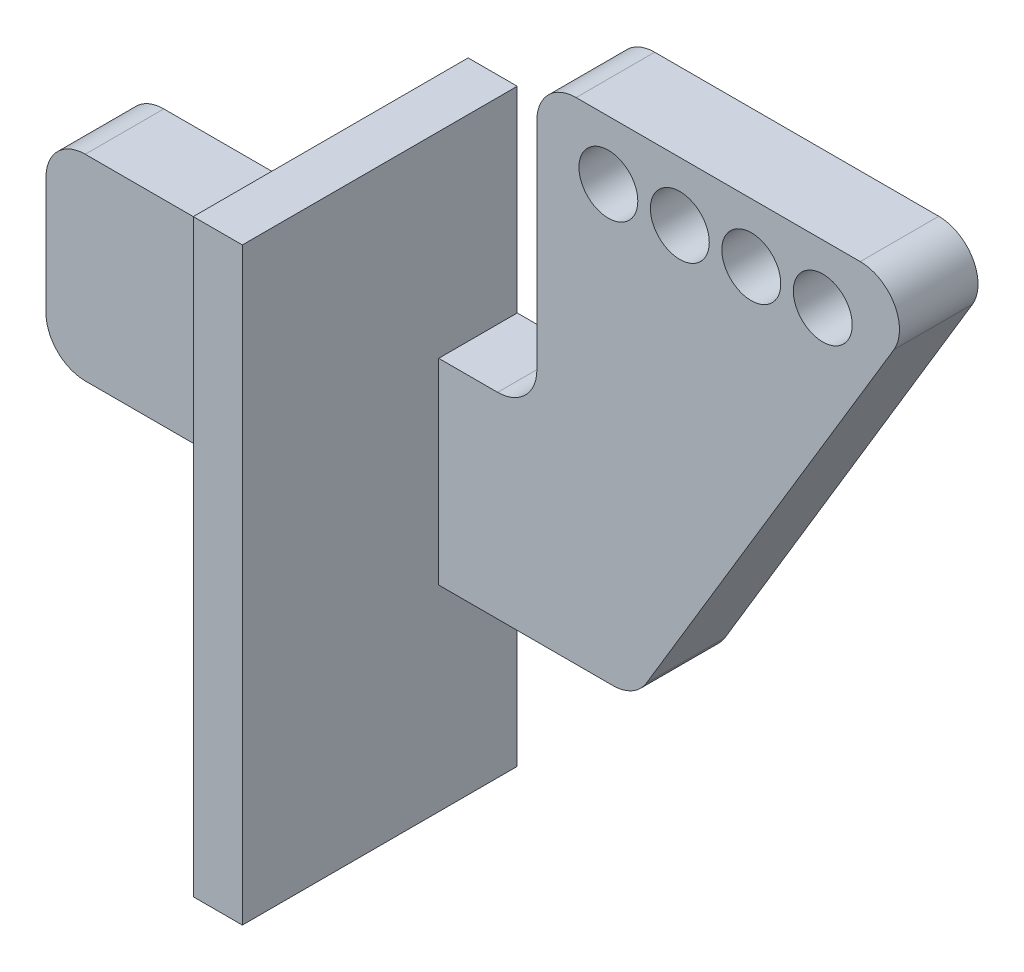
ISO-10303-21;
HEADER;
FILE_DESCRIPTION(('STEP AP214'),'2;1');
FILE_NAME('part.step','',(''),(''),'','','');
FILE_SCHEMA(('AUTOMOTIVE_DESIGN { 1 0 10303 214 1 1 1 1 }'));
ENDSEC;
DATA;
#1=APPLICATION_CONTEXT('core data for automotive mechanical design processes');
#2=APPLICATION_PROTOCOL_DEFINITION('international standard','automotive_design',2000,#1);
#3=PRODUCT_CONTEXT('',#1,'mechanical');
#4=PRODUCT('Part','Part','',(#3));
#5=PRODUCT_RELATED_PRODUCT_CATEGORY('part','',(#4));
#6=PRODUCT_DEFINITION_FORMATION('','',#4);
#7=PRODUCT_DEFINITION_CONTEXT('part definition',#1,'design');
#8=PRODUCT_DEFINITION('design','',#6,#7);
#9=PRODUCT_DEFINITION_SHAPE('','',#8);
#10=(LENGTH_UNIT() NAMED_UNIT(*) SI_UNIT(.MILLI.,.METRE.));
#11=(NAMED_UNIT(*) PLANE_ANGLE_UNIT() SI_UNIT($,.RADIAN.));
#12=(NAMED_UNIT(*) SI_UNIT($,.STERADIAN.) SOLID_ANGLE_UNIT());
#13=UNCERTAINTY_MEASURE_WITH_UNIT(LENGTH_MEASURE(1.E-05),#10,'distance_accuracy_value','');
#14=(GEOMETRIC_REPRESENTATION_CONTEXT(3) GLOBAL_UNCERTAINTY_ASSIGNED_CONTEXT((#13)) GLOBAL_UNIT_ASSIGNED_CONTEXT((#10,
#11,#12)) REPRESENTATION_CONTEXT('',''));
#15=CARTESIAN_POINT('',(0.,0.,0.));
#16=DIRECTION('',(0.,0.,1.));
#17=DIRECTION('',(1.,0.,0.));
#18=AXIS2_PLACEMENT_3D('',#15,#16,#17);
#19=CARTESIAN_POINT('',(0.,0.,4.));
#20=DIRECTION('',(0.,0.,-1.));
#21=DIRECTION('',(-1.,0.,0.));
#22=AXIS2_PLACEMENT_3D('',#19,#20,#21);
#23=PLANE('',#22);
#24=DIRECTION('',(0.,-1.,0.));
#25=VECTOR('',#24,1.);
#26=CARTESIAN_POINT('',(-25.,-10.,4.));
#27=LINE('',#26,#25);
#28=CARTESIAN_POINT('',(-25.,-2.,4.));
#29=VERTEX_POINT('',#28);
#30=CARTESIAN_POINT('',(-25.,-8.,4.));
#31=VERTEX_POINT('',#30);
#32=EDGE_CURVE('E266',#29,#31,#27,.T.);
#33=ORIENTED_EDGE('',*,*,#32,.T.);
#34=CARTESIAN_POINT('',(-23.,-8.,4.));
#35=DIRECTION('',(0.,0.,-1.));
#36=DIRECTION('',(-1.,0.,0.));
#37=AXIS2_PLACEMENT_3D('',#34,#35,#36);
#38=CIRCLE('',#37,2.);
#39=CARTESIAN_POINT('',(-23.,-10.,4.));
#40=VERTEX_POINT('',#39);
#41=EDGE_CURVE('E381',#31,#40,#38,.F.);
#42=ORIENTED_EDGE('',*,*,#41,.T.);
#43=DIRECTION('',(1.,0.,0.));
#44=VECTOR('',#43,1.);
#45=CARTESIAN_POINT('',(-25.,-10.,4.));
#46=LINE('',#45,#44);
#47=CARTESIAN_POINT('',(-7.5,-10.,4.));
#48=VERTEX_POINT('',#47);
#49=EDGE_CURVE('E270',#40,#48,#46,.T.);
#50=ORIENTED_EDGE('',*,*,#49,.T.);
#51=DIRECTION('',(0.,-1.,0.));
#52=VECTOR('',#51,1.);
#53=CARTESIAN_POINT('',(-7.5,10.,4.));
#54=LINE('',#53,#52);
#55=CARTESIAN_POINT('',(-7.5,0.,4.));
#56=VERTEX_POINT('',#55);
#57=EDGE_CURVE('E216',#56,#48,#54,.T.);
#58=ORIENTED_EDGE('',*,*,#57,.F.);
#59=DIRECTION('',(-1.,0.,0.));
#60=VECTOR('',#59,1.);
#61=CARTESIAN_POINT('',(-7.5,0.,4.));
#62=LINE('',#61,#60);
#63=CARTESIAN_POINT('',(-23.,0.,4.));
#64=VERTEX_POINT('',#63);
#65=EDGE_CURVE('E261',#56,#64,#62,.T.);
#66=ORIENTED_EDGE('',*,*,#65,.T.);
#67=CARTESIAN_POINT('',(-23.,-2.,4.));
#68=DIRECTION('',(0.,0.,-1.));
#69=DIRECTION('',(-1.,0.,0.));
#70=AXIS2_PLACEMENT_3D('',#67,#68,#69);
#71=CIRCLE('',#70,2.);
#72=EDGE_CURVE('E378',#64,#29,#71,.F.);
#73=ORIENTED_EDGE('',*,*,#72,.T.);
#74=EDGE_LOOP('',(#33,#42,#50,#58,#66,#73));
#75=FACE_BOUND('',#74,.T.);
#76=ADVANCED_FACE('F39',(#75),#23,.F.);
#77=CARTESIAN_POINT('',(14.56,12.,4.));
#78=DIRECTION('',(0.,0.,1.));
#79=DIRECTION('',(1.,0.,0.));
#80=AXIS2_PLACEMENT_3D('',#77,#78,#79);
#81=CIRCLE('',#80,1.5);
#82=CARTESIAN_POINT('',(16.06,12.,4.));
#83=VERTEX_POINT('',#82);
#84=EDGE_CURVE('E226',#83,#83,#81,.T.);
#85=ORIENTED_EDGE('',*,*,#84,.F.);
#86=EDGE_LOOP('',(#85));
#87=FACE_BOUND('',#86,.T.);
#88=CARTESIAN_POINT('',(10.92,12.,4.));
#89=DIRECTION('',(0.,0.,1.));
#90=DIRECTION('',(1.,0.,0.));
#91=AXIS2_PLACEMENT_3D('',#88,#89,#90);
#92=CIRCLE('',#91,1.5);
#93=CARTESIAN_POINT('',(12.42,12.,4.));
#94=VERTEX_POINT('',#93);
#95=EDGE_CURVE('E234',#94,#94,#92,.T.);
#96=ORIENTED_EDGE('',*,*,#95,.F.);
#97=EDGE_LOOP('',(#96));
#98=FACE_BOUND('',#97,.T.);
#99=CARTESIAN_POINT('',(7.28,12.,4.));
#100=DIRECTION('',(0.,0.,1.));
#101=DIRECTION('',(1.,0.,0.));
#102=AXIS2_PLACEMENT_3D('',#99,#100,#101);
#103=CIRCLE('',#102,1.5);
#104=CARTESIAN_POINT('',(8.78,12.,4.));
#105=VERTEX_POINT('',#104);
#106=EDGE_CURVE('E242',#105,#105,#103,.T.);
#107=ORIENTED_EDGE('',*,*,#106,.F.);
#108=EDGE_LOOP('',(#107));
#109=FACE_BOUND('',#108,.T.);
#110=CARTESIAN_POINT('',(3.64,12.,4.));
#111=DIRECTION('',(0.,0.,1.));
#112=DIRECTION('',(1.,0.,0.));
#113=AXIS2_PLACEMENT_3D('',#110,#111,#112);
#114=CIRCLE('',#113,1.5);
#115=CARTESIAN_POINT('',(5.14,12.,4.));
#116=VERTEX_POINT('',#115);
#117=EDGE_CURVE('E250',#116,#116,#114,.T.);
#118=ORIENTED_EDGE('',*,*,#117,.F.);
#119=EDGE_LOOP('',(#118));
#120=FACE_BOUND('',#119,.T.);
#121=DIRECTION('',(-1.,0.,0.));
#122=VECTOR('',#121,1.);
#123=CARTESIAN_POINT('',(0.,15.,4.));
#124=LINE('',#123,#122);
#125=CARTESIAN_POINT('',(16.4676192420619,15.,4.));
#126=VERTEX_POINT('',#125);
#127=CARTESIAN_POINT('',(2.,15.,4.));
#128=VERTEX_POINT('',#127);
#129=EDGE_CURVE('E279',#126,#128,#124,.T.);
#130=ORIENTED_EDGE('',*,*,#129,.T.);
#131=CARTESIAN_POINT('',(2.,13.,4.));
#132=DIRECTION('',(0.,0.,-1.));
#133=DIRECTION('',(-1.,0.,0.));
#134=AXIS2_PLACEMENT_3D('',#131,#132,#133);
#135=CIRCLE('',#134,2.);
#136=CARTESIAN_POINT('',(0.,13.,4.));
#137=VERTEX_POINT('',#136);
#138=EDGE_CURVE('E410',#128,#137,#135,.F.);
#139=ORIENTED_EDGE('',*,*,#138,.T.);
#140=DIRECTION('',(0.,-1.,0.));
#141=VECTOR('',#140,1.);
#142=CARTESIAN_POINT('',(0.,0.,4.));
#143=LINE('',#142,#141);
#144=CARTESIAN_POINT('',(0.,2.,4.));
#145=VERTEX_POINT('',#144);
#146=EDGE_CURVE('E283',#137,#145,#143,.T.);
#147=ORIENTED_EDGE('',*,*,#146,.T.);
#148=CARTESIAN_POINT('',(-2.,2.,4.));
#149=DIRECTION('',(0.,0.,-1.));
#150=DIRECTION('',(-1.,0.,0.));
#151=AXIS2_PLACEMENT_3D('',#148,#149,#150);
#152=CIRCLE('',#151,2.);
#153=CARTESIAN_POINT('',(-2.,0.,4.));
#154=VERTEX_POINT('',#153);
#155=EDGE_CURVE('E11',#145,#154,#152,.T.);
#156=ORIENTED_EDGE('',*,*,#155,.T.);
#157=DIRECTION('',(-1.,0.,0.));
#158=VECTOR('',#157,1.);
#159=CARTESIAN_POINT('',(0.,0.,4.));
#160=LINE('',#159,#158);
#161=CARTESIAN_POINT('',(-5.,0.,4.));
#162=VERTEX_POINT('',#161);
#163=EDGE_CURVE('E258',#154,#162,#160,.T.);
#164=ORIENTED_EDGE('',*,*,#163,.T.);
#165=DIRECTION('',(0.,1.,0.));
#166=VECTOR('',#165,1.);
#167=CARTESIAN_POINT('',(-5.,10.,4.));
#168=LINE('',#167,#166);
#169=CARTESIAN_POINT('',(-5.,-10.,4.));
#170=VERTEX_POINT('',#169);
#171=EDGE_CURVE('E221',#170,#162,#168,.T.);
#172=ORIENTED_EDGE('',*,*,#171,.F.);
#173=DIRECTION('',(1.,0.,0.));
#174=VECTOR('',#173,1.);
#175=CARTESIAN_POINT('',(-5.,-10.,4.));
#176=LINE('',#175,#174);
#177=CARTESIAN_POINT('',(3.86761924206188,-10.,4.));
#178=VERTEX_POINT('',#177);
#179=EDGE_CURVE('E273',#170,#178,#176,.T.);
#180=ORIENTED_EDGE('',*,*,#179,.T.);
#181=CARTESIAN_POINT('',(3.86761924206188,-8.,4.));
#182=DIRECTION('',(0.,0.,-1.));
#183=DIRECTION('',(-1.,0.,0.));
#184=AXIS2_PLACEMENT_3D('',#181,#182,#183);
#185=CIRCLE('',#184,2.);
#186=CARTESIAN_POINT('',(5.58260509348696,-9.02899151085506,4.));
#187=VERTEX_POINT('',#186);
#188=EDGE_CURVE('E62',#178,#187,#185,.F.);
#189=ORIENTED_EDGE('',*,*,#188,.T.);
#190=DIRECTION('',(0.514495755427527,0.857492925712544,0.));
#191=VECTOR('',#190,1.);
#192=CARTESIAN_POINT('',(20.,15.,4.));
#193=LINE('',#192,#191);
#194=CARTESIAN_POINT('',(18.182605093487,11.9710084891449,4.));
#195=VERTEX_POINT('',#194);
#196=EDGE_CURVE('E276',#187,#195,#193,.T.);
#197=ORIENTED_EDGE('',*,*,#196,.T.);
#198=CARTESIAN_POINT('',(16.4676192420619,13.,4.));
#199=DIRECTION('',(0.,0.,-1.));
#200=DIRECTION('',(-1.,0.,0.));
#201=AXIS2_PLACEMENT_3D('',#198,#199,#200);
#202=CIRCLE('',#201,2.);
#203=EDGE_CURVE('E407',#195,#126,#202,.F.);
#204=ORIENTED_EDGE('',*,*,#203,.T.);
#205=EDGE_LOOP('',(#130,#139,#147,#156,#164,#172,#180,#189,#197,#204));
#206=FACE_BOUND('',#205,.T.);
#207=ADVANCED_FACE('F441',(#87,#98,#109,#120,#206),#23,.F.);
#208=CARTESIAN_POINT('',(0.,0.,0.));
#209=DIRECTION('',(0.,0.,-1.));
#210=DIRECTION('',(-1.,0.,0.));
#211=AXIS2_PLACEMENT_3D('',#208,#209,#210);
#212=PLANE('',#211);
#213=CARTESIAN_POINT('',(10.92,12.,0.));
#214=DIRECTION('',(0.,0.,1.));
#215=DIRECTION('',(1.,0.,0.));
#216=AXIS2_PLACEMENT_3D('',#213,#214,#215);
#217=CIRCLE('',#216,1.5);
#218=CARTESIAN_POINT('',(12.42,12.,0.));
#219=VERTEX_POINT('',#218);
#220=EDGE_CURVE('E230',#219,#219,#217,.T.);
#221=ORIENTED_EDGE('',*,*,#220,.T.);
#222=EDGE_LOOP('',(#221));
#223=FACE_BOUND('',#222,.T.);
#224=CARTESIAN_POINT('',(3.64,12.,0.));
#225=DIRECTION('',(0.,0.,1.));
#226=DIRECTION('',(1.,0.,0.));
#227=AXIS2_PLACEMENT_3D('',#224,#225,#226);
#228=CIRCLE('',#227,1.5);
#229=CARTESIAN_POINT('',(5.14,12.,0.));
#230=VERTEX_POINT('',#229);
#231=EDGE_CURVE('E246',#230,#230,#228,.T.);
#232=ORIENTED_EDGE('',*,*,#231,.T.);
#233=EDGE_LOOP('',(#232));
#234=FACE_BOUND('',#233,.T.);
#235=DIRECTION('',(1.,0.,0.));
#236=VECTOR('',#235,1.);
#237=CARTESIAN_POINT('',(-25.,-10.,0.));
#238=LINE('',#237,#236);
#239=CARTESIAN_POINT('',(-23.,-10.,0.));
#240=VERTEX_POINT('',#239);
#241=CARTESIAN_POINT('',(-7.5,-10.,0.));
#242=VERTEX_POINT('',#241);
#243=EDGE_CURVE('E307',#240,#242,#238,.T.);
#244=ORIENTED_EDGE('',*,*,#243,.F.);
#245=CARTESIAN_POINT('',(-23.,-8.,0.));
#246=DIRECTION('',(0.,0.,-1.));
#247=DIRECTION('',(-1.,0.,0.));
#248=AXIS2_PLACEMENT_3D('',#245,#246,#247);
#249=CIRCLE('',#248,2.);
#250=CARTESIAN_POINT('',(-25.,-8.,0.));
#251=VERTEX_POINT('',#250);
#252=EDGE_CURVE('E368',#240,#251,#249,.T.);
#253=ORIENTED_EDGE('',*,*,#252,.T.);
#254=DIRECTION('',(0.,-1.,0.));
#255=VECTOR('',#254,1.);
#256=CARTESIAN_POINT('',(-25.,-10.,0.));
#257=LINE('',#256,#255);
#258=CARTESIAN_POINT('',(-25.,-2.,0.));
#259=VERTEX_POINT('',#258);
#260=EDGE_CURVE('E303',#259,#251,#257,.T.);
#261=ORIENTED_EDGE('',*,*,#260,.F.);
#262=CARTESIAN_POINT('',(-23.,-2.,0.));
#263=DIRECTION('',(0.,0.,-1.));
#264=DIRECTION('',(-1.,0.,0.));
#265=AXIS2_PLACEMENT_3D('',#262,#263,#264);
#266=CIRCLE('',#265,2.);
#267=CARTESIAN_POINT('',(-23.,0.,0.));
#268=VERTEX_POINT('',#267);
#269=EDGE_CURVE('E365',#259,#268,#266,.T.);
#270=ORIENTED_EDGE('',*,*,#269,.T.);
#271=DIRECTION('',(-1.,0.,0.));
#272=VECTOR('',#271,1.);
#273=CARTESIAN_POINT('',(-7.5,0.,0.));
#274=LINE('',#273,#272);
#275=CARTESIAN_POINT('',(-7.5,0.,0.));
#276=VERTEX_POINT('',#275);
#277=EDGE_CURVE('E299',#276,#268,#274,.T.);
#278=ORIENTED_EDGE('',*,*,#277,.F.);
#279=DIRECTION('',(0.,-1.,0.));
#280=VECTOR('',#279,1.);
#281=CARTESIAN_POINT('',(-7.5,10.,0.));
#282=LINE('',#281,#280);
#283=CARTESIAN_POINT('',(-7.5,10.,0.));
#284=VERTEX_POINT('',#283);
#285=EDGE_CURVE('E296',#284,#276,#282,.T.);
#286=ORIENTED_EDGE('',*,*,#285,.F.);
#287=DIRECTION('',(-1.,0.,0.));
#288=VECTOR('',#287,1.);
#289=CARTESIAN_POINT('',(-5.,10.,0.));
#290=LINE('',#289,#288);
#291=CARTESIAN_POINT('',(-5.,10.,0.));
#292=VERTEX_POINT('',#291);
#293=EDGE_CURVE('E293',#292,#284,#290,.T.);
#294=ORIENTED_EDGE('',*,*,#293,.F.);
#295=DIRECTION('',(0.,1.,0.));
#296=VECTOR('',#295,1.);
#297=CARTESIAN_POINT('',(-5.,0.,0.));
#298=LINE('',#297,#296);
#299=CARTESIAN_POINT('',(-5.,0.,0.));
#300=VERTEX_POINT('',#299);
#301=EDGE_CURVE('E290',#300,#292,#298,.T.);
#302=ORIENTED_EDGE('',*,*,#301,.F.);
#303=DIRECTION('',(-1.,0.,0.));
#304=VECTOR('',#303,1.);
#305=CARTESIAN_POINT('',(0.,0.,0.));
#306=LINE('',#305,#304);
#307=CARTESIAN_POINT('',(-2.,0.,0.));
#308=VERTEX_POINT('',#307);
#309=EDGE_CURVE('E254',#308,#300,#306,.T.);
#310=ORIENTED_EDGE('',*,*,#309,.F.);
#311=CARTESIAN_POINT('',(-2.,2.,0.));
#312=DIRECTION('',(0.,0.,-1.));
#313=DIRECTION('',(-1.,0.,0.));
#314=AXIS2_PLACEMENT_3D('',#311,#312,#313);
#315=CIRCLE('',#314,2.);
#316=CARTESIAN_POINT('',(0.,2.,0.));
#317=VERTEX_POINT('',#316);
#318=EDGE_CURVE('E48',#308,#317,#315,.F.);
#319=ORIENTED_EDGE('',*,*,#318,.T.);
#320=DIRECTION('',(0.,-1.,0.));
#321=VECTOR('',#320,1.);
#322=CARTESIAN_POINT('',(0.,0.,0.));
#323=LINE('',#322,#321);
#324=CARTESIAN_POINT('',(0.,13.,0.));
#325=VERTEX_POINT('',#324);
#326=EDGE_CURVE('E262',#325,#317,#323,.T.);
#327=ORIENTED_EDGE('',*,*,#326,.F.);
#328=CARTESIAN_POINT('',(2.,13.,0.));
#329=DIRECTION('',(0.,0.,-1.));
#330=DIRECTION('',(-1.,0.,0.));
#331=AXIS2_PLACEMENT_3D('',#328,#329,#330);
#332=CIRCLE('',#331,2.);
#333=CARTESIAN_POINT('',(2.,15.,0.));
#334=VERTEX_POINT('',#333);
#335=EDGE_CURVE('E362',#325,#334,#332,.T.);
#336=ORIENTED_EDGE('',*,*,#335,.T.);
#337=DIRECTION('',(-1.,0.,0.));
#338=VECTOR('',#337,1.);
#339=CARTESIAN_POINT('',(0.,15.,0.));
#340=LINE('',#339,#338);
#341=CARTESIAN_POINT('',(16.4676192420619,15.,0.));
#342=VERTEX_POINT('',#341);
#343=EDGE_CURVE('E325',#342,#334,#340,.T.);
#344=ORIENTED_EDGE('',*,*,#343,.F.);
#345=CARTESIAN_POINT('',(16.4676192420619,13.,0.));
#346=DIRECTION('',(0.,0.,-1.));
#347=DIRECTION('',(-1.,0.,0.));
#348=AXIS2_PLACEMENT_3D('',#345,#346,#347);
#349=CIRCLE('',#348,2.);
#350=CARTESIAN_POINT('',(18.182605093487,11.9710084891449,0.));
#351=VERTEX_POINT('',#350);
#352=EDGE_CURVE('E359',#342,#351,#349,.T.);
#353=ORIENTED_EDGE('',*,*,#352,.T.);
#354=DIRECTION('',(0.514495755427527,0.857492925712544,0.));
#355=VECTOR('',#354,1.);
#356=CARTESIAN_POINT('',(20.,15.,0.));
#357=LINE('',#356,#355);
#358=CARTESIAN_POINT('',(5.58260509348696,-9.02899151085506,0.));
#359=VERTEX_POINT('',#358);
#360=EDGE_CURVE('E322',#359,#351,#357,.T.);
#361=ORIENTED_EDGE('',*,*,#360,.F.);
#362=CARTESIAN_POINT('',(3.86761924206188,-8.,0.));
#363=DIRECTION('',(0.,0.,-1.));
#364=DIRECTION('',(-1.,0.,0.));
#365=AXIS2_PLACEMENT_3D('',#362,#363,#364);
#366=CIRCLE('',#365,2.);
#367=CARTESIAN_POINT('',(3.86761924206188,-10.,0.));
#368=VERTEX_POINT('',#367);
#369=EDGE_CURVE('E356',#359,#368,#366,.T.);
#370=ORIENTED_EDGE('',*,*,#369,.T.);
#371=DIRECTION('',(1.,0.,0.));
#372=VECTOR('',#371,1.);
#373=CARTESIAN_POINT('',(-5.,-10.,0.));
#374=LINE('',#373,#372);
#375=CARTESIAN_POINT('',(-5.,-10.,0.));
#376=VERTEX_POINT('',#375);
#377=EDGE_CURVE('E318',#376,#368,#374,.T.);
#378=ORIENTED_EDGE('',*,*,#377,.F.);
#379=DIRECTION('',(0.,1.,0.));
#380=VECTOR('',#379,1.);
#381=CARTESIAN_POINT('',(-5.,-20.,0.));
#382=LINE('',#381,#380);
#383=CARTESIAN_POINT('',(-5.,-20.,0.));
#384=VERTEX_POINT('',#383);
#385=EDGE_CURVE('E315',#384,#376,#382,.T.);
#386=ORIENTED_EDGE('',*,*,#385,.F.);
#387=DIRECTION('',(1.,0.,0.));
#388=VECTOR('',#387,1.);
#389=CARTESIAN_POINT('',(-7.5,-20.,0.));
#390=LINE('',#389,#388);
#391=CARTESIAN_POINT('',(-7.5,-20.,0.));
#392=VERTEX_POINT('',#391);
#393=EDGE_CURVE('E312',#392,#384,#390,.T.);
#394=ORIENTED_EDGE('',*,*,#393,.F.);
#395=DIRECTION('',(0.,-1.,0.));
#396=VECTOR('',#395,1.);
#397=CARTESIAN_POINT('',(-7.5,-10.,0.));
#398=LINE('',#397,#396);
#399=EDGE_CURVE('E186',#242,#392,#398,.T.);
#400=ORIENTED_EDGE('',*,*,#399,.F.);
#401=EDGE_LOOP('',(#244,#253,#261,#270,#278,#286,#294,#302,#310,#319,#327,#336,#344,#353,#361,
#370,#378,#386,#394,#400));
#402=FACE_BOUND('',#401,.T.);
#403=CARTESIAN_POINT('',(7.28,12.,0.));
#404=DIRECTION('',(0.,0.,1.));
#405=DIRECTION('',(1.,0.,0.));
#406=AXIS2_PLACEMENT_3D('',#403,#404,#405);
#407=CIRCLE('',#406,1.5);
#408=CARTESIAN_POINT('',(8.78,12.,0.));
#409=VERTEX_POINT('',#408);
#410=EDGE_CURVE('E238',#409,#409,#407,.T.);
#411=ORIENTED_EDGE('',*,*,#410,.T.);
#412=EDGE_LOOP('',(#411));
#413=FACE_BOUND('',#412,.T.);
#414=CARTESIAN_POINT('',(14.56,12.,0.));
#415=DIRECTION('',(0.,0.,1.));
#416=DIRECTION('',(1.,0.,0.));
#417=AXIS2_PLACEMENT_3D('',#414,#415,#416);
#418=CIRCLE('',#417,1.5);
#419=CARTESIAN_POINT('',(16.06,12.,0.));
#420=VERTEX_POINT('',#419);
#421=EDGE_CURVE('E215',#420,#420,#418,.T.);
#422=ORIENTED_EDGE('',*,*,#421,.T.);
#423=EDGE_LOOP('',(#422));
#424=FACE_BOUND('',#423,.T.);
#425=ADVANCED_FACE('F428',(#223,#234,#402,#413,#424),#212,.T.);
#426=CARTESIAN_POINT('',(0.,0.,4.));
#427=DIRECTION('',(0.,-1.,0.));
#428=DIRECTION('',(1.,0.,0.));
#429=AXIS2_PLACEMENT_3D('',#426,#427,#428);
#430=PLANE('',#429);
#431=ORIENTED_EDGE('',*,*,#163,.F.);
#432=DIRECTION('',(0.,0.,-1.));
#433=VECTOR('',#432,1.);
#434=CARTESIAN_POINT('',(-2.,0.,0.));
#435=LINE('',#434,#433);
#436=EDGE_CURVE('E387',#154,#308,#435,.T.);
#437=ORIENTED_EDGE('',*,*,#436,.T.);
#438=ORIENTED_EDGE('',*,*,#309,.T.);
#439=DIRECTION('',(0.,0.,-1.));
#440=VECTOR('',#439,1.);
#441=CARTESIAN_POINT('',(-5.,0.,4.));
#442=LINE('',#441,#440);
#443=EDGE_CURVE('E225',#162,#300,#442,.T.);
#444=ORIENTED_EDGE('',*,*,#443,.F.);
#445=EDGE_LOOP('',(#431,#437,#438,#444));
#446=FACE_BOUND('',#445,.T.);
#447=ADVANCED_FACE('F444',(#446),#430,.F.);
#448=CARTESIAN_POINT('',(-5.,10.,4.));
#449=DIRECTION('',(0.,-1.,0.));
#450=DIRECTION('',(1.,0.,0.));
#451=AXIS2_PLACEMENT_3D('',#448,#449,#450);
#452=PLANE('',#451);
#453=ORIENTED_EDGE('',*,*,#293,.T.);
#454=DIRECTION('',(0.,0.,-1.));
#455=VECTOR('',#454,1.);
#456=CARTESIAN_POINT('',(-7.5,10.,4.));
#457=LINE('',#456,#455);
#458=CARTESIAN_POINT('',(-7.5,10.,14.));
#459=VERTEX_POINT('',#458);
#460=EDGE_CURVE('E343',#459,#284,#457,.T.);
#461=ORIENTED_EDGE('',*,*,#460,.F.);
#462=DIRECTION('',(-1.,0.,0.));
#463=VECTOR('',#462,1.);
#464=CARTESIAN_POINT('',(-7.5,10.,14.));
#465=LINE('',#464,#463);
#466=CARTESIAN_POINT('',(-5.,10.,14.));
#467=VERTEX_POINT('',#466);
#468=EDGE_CURVE('E206',#467,#459,#465,.T.);
#469=ORIENTED_EDGE('',*,*,#468,.F.);
#470=DIRECTION('',(0.,0.,-1.));
#471=VECTOR('',#470,1.);
#472=CARTESIAN_POINT('',(-5.,10.,4.));
#473=LINE('',#472,#471);
#474=EDGE_CURVE('E346',#467,#292,#473,.T.);
#475=ORIENTED_EDGE('',*,*,#474,.T.);
#476=EDGE_LOOP('',(#453,#461,#469,#475));
#477=FACE_BOUND('',#476,.T.);
#478=ADVANCED_FACE('F516',(#477),#452,.F.);
#479=CARTESIAN_POINT('',(-7.5,0.,4.));
#480=DIRECTION('',(0.,-1.,0.));
#481=DIRECTION('',(1.,0.,0.));
#482=AXIS2_PLACEMENT_3D('',#479,#480,#481);
#483=PLANE('',#482);
#484=ORIENTED_EDGE('',*,*,#277,.T.);
#485=DIRECTION('',(0.,0.,-1.));
#486=VECTOR('',#485,1.);
#487=CARTESIAN_POINT('',(-23.,0.,4.));
#488=LINE('',#487,#486);
#489=EDGE_CURVE('E384',#268,#64,#488,.F.);
#490=ORIENTED_EDGE('',*,*,#489,.T.);
#491=ORIENTED_EDGE('',*,*,#65,.F.);
#492=DIRECTION('',(0.,0.,-1.));
#493=VECTOR('',#492,1.);
#494=CARTESIAN_POINT('',(-7.5,0.,4.));
#495=LINE('',#494,#493);
#496=EDGE_CURVE('E339',#56,#276,#495,.T.);
#497=ORIENTED_EDGE('',*,*,#496,.T.);
#498=EDGE_LOOP('',(#484,#490,#491,#497));
#499=FACE_BOUND('',#498,.T.);
#500=ADVANCED_FACE('F512',(#499),#483,.F.);
#501=CARTESIAN_POINT('',(-25.,-10.,4.));
#502=DIRECTION('',(1.,0.,0.));
#503=DIRECTION('',(0.,0.,-1.));
#504=AXIS2_PLACEMENT_3D('',#501,#502,#503);
#505=PLANE('',#504);
#506=ORIENTED_EDGE('',*,*,#260,.T.);
#507=DIRECTION('',(0.,0.,-1.));
#508=VECTOR('',#507,1.);
#509=CARTESIAN_POINT('',(-25.,-8.,4.));
#510=LINE('',#509,#508);
#511=EDGE_CURVE('E375',#251,#31,#510,.F.);
#512=ORIENTED_EDGE('',*,*,#511,.T.);
#513=ORIENTED_EDGE('',*,*,#32,.F.);
#514=DIRECTION('',(0.,0.,-1.));
#515=VECTOR('',#514,1.);
#516=CARTESIAN_POINT('',(-25.,-2.,4.));
#517=LINE('',#516,#515);
#518=EDGE_CURVE('E371',#29,#259,#517,.T.);
#519=ORIENTED_EDGE('',*,*,#518,.T.);
#520=EDGE_LOOP('',(#506,#512,#513,#519));
#521=FACE_BOUND('',#520,.T.);
#522=ADVANCED_FACE('F508',(#521),#505,.F.);
#523=CARTESIAN_POINT('',(-25.,-10.,4.));
#524=DIRECTION('',(0.,1.,0.));
#525=DIRECTION('',(-1.,0.,0.));
#526=AXIS2_PLACEMENT_3D('',#523,#524,#525);
#527=PLANE('',#526);
#528=ORIENTED_EDGE('',*,*,#49,.F.);
#529=DIRECTION('',(0.,0.,-1.));
#530=VECTOR('',#529,1.);
#531=CARTESIAN_POINT('',(-23.,-10.,4.));
#532=LINE('',#531,#530);
#533=EDGE_CURVE('E220',#40,#240,#532,.T.);
#534=ORIENTED_EDGE('',*,*,#533,.T.);
#535=ORIENTED_EDGE('',*,*,#243,.T.);
#536=DIRECTION('',(0.,0.,-1.));
#537=VECTOR('',#536,1.);
#538=CARTESIAN_POINT('',(-7.5,-10.,4.));
#539=LINE('',#538,#537);
#540=EDGE_CURVE('E190',#48,#242,#539,.T.);
#541=ORIENTED_EDGE('',*,*,#540,.F.);
#542=EDGE_LOOP('',(#528,#534,#535,#541));
#543=FACE_BOUND('',#542,.T.);
#544=ADVANCED_FACE('F505',(#543),#527,.F.);
#545=CARTESIAN_POINT('',(-7.5,-10.,4.));
#546=DIRECTION('',(1.,0.,0.));
#547=DIRECTION('',(0.,1.,0.));
#548=AXIS2_PLACEMENT_3D('',#545,#546,#547);
#549=PLANE('',#548);
#550=ORIENTED_EDGE('',*,*,#399,.T.);
#551=DIRECTION('',(0.,0.,-1.));
#552=VECTOR('',#551,1.);
#553=CARTESIAN_POINT('',(-7.5,-20.,4.));
#554=LINE('',#553,#552);
#555=CARTESIAN_POINT('',(-7.5,-20.,14.));
#556=VERTEX_POINT('',#555);
#557=EDGE_CURVE('E178',#556,#392,#554,.T.);
#558=ORIENTED_EDGE('',*,*,#557,.F.);
#559=DIRECTION('',(0.,-1.,0.));
#560=VECTOR('',#559,1.);
#561=CARTESIAN_POINT('',(-7.5,10.,14.));
#562=LINE('',#561,#560);
#563=EDGE_CURVE('E183',#459,#556,#562,.T.);
#564=ORIENTED_EDGE('',*,*,#563,.F.);
#565=ORIENTED_EDGE('',*,*,#460,.T.);
#566=ORIENTED_EDGE('',*,*,#285,.T.);
#567=ORIENTED_EDGE('',*,*,#496,.F.);
#568=ORIENTED_EDGE('',*,*,#57,.T.);
#569=ORIENTED_EDGE('',*,*,#540,.T.);
#570=EDGE_LOOP('',(#550,#558,#564,#565,#566,#567,#568,#569));
#571=FACE_BOUND('',#570,.T.);
#572=ADVANCED_FACE('F180',(#571),#549,.F.);
#573=CARTESIAN_POINT('',(-7.5,-20.,4.));
#574=DIRECTION('',(0.,1.,0.));
#575=DIRECTION('',(0.,0.,1.));
#576=AXIS2_PLACEMENT_3D('',#573,#574,#575);
#577=PLANE('',#576);
#578=ORIENTED_EDGE('',*,*,#393,.T.);
#579=DIRECTION('',(0.,0.,-1.));
#580=VECTOR('',#579,1.);
#581=CARTESIAN_POINT('',(-5.,-20.,4.));
#582=LINE('',#581,#580);
#583=CARTESIAN_POINT('',(-5.,-20.,14.));
#584=VERTEX_POINT('',#583);
#585=EDGE_CURVE('E191',#584,#384,#582,.T.);
#586=ORIENTED_EDGE('',*,*,#585,.F.);
#587=DIRECTION('',(1.,0.,0.));
#588=VECTOR('',#587,1.);
#589=CARTESIAN_POINT('',(-7.5,-20.,14.));
#590=LINE('',#589,#588);
#591=EDGE_CURVE('E194',#556,#584,#590,.T.);
#592=ORIENTED_EDGE('',*,*,#591,.F.);
#593=ORIENTED_EDGE('',*,*,#557,.T.);
#594=EDGE_LOOP('',(#578,#586,#592,#593));
#595=FACE_BOUND('',#594,.T.);
#596=ADVANCED_FACE('F195',(#595),#577,.F.);
#597=CARTESIAN_POINT('',(-5.,-20.,4.));
#598=DIRECTION('',(-1.,0.,0.));
#599=DIRECTION('',(0.,0.,1.));
#600=AXIS2_PLACEMENT_3D('',#597,#598,#599);
#601=PLANE('',#600);
#602=ORIENTED_EDGE('',*,*,#385,.T.);
#603=DIRECTION('',(0.,0.,-1.));
#604=VECTOR('',#603,1.);
#605=CARTESIAN_POINT('',(-5.,-10.,4.));
#606=LINE('',#605,#604);
#607=EDGE_CURVE('E287',#170,#376,#606,.T.);
#608=ORIENTED_EDGE('',*,*,#607,.F.);
#609=ORIENTED_EDGE('',*,*,#171,.T.);
#610=ORIENTED_EDGE('',*,*,#443,.T.);
#611=ORIENTED_EDGE('',*,*,#301,.T.);
#612=ORIENTED_EDGE('',*,*,#474,.F.);
#613=DIRECTION('',(0.,1.,0.));
#614=VECTOR('',#613,1.);
#615=CARTESIAN_POINT('',(-5.,10.,14.));
#616=LINE('',#615,#614);
#617=EDGE_CURVE('E201',#584,#467,#616,.T.);
#618=ORIENTED_EDGE('',*,*,#617,.F.);
#619=ORIENTED_EDGE('',*,*,#585,.T.);
#620=EDGE_LOOP('',(#602,#608,#609,#610,#611,#612,#618,#619));
#621=FACE_BOUND('',#620,.T.);
#622=ADVANCED_FACE('F447',(#621),#601,.F.);
#623=CARTESIAN_POINT('',(-5.,-10.,4.));
#624=DIRECTION('',(0.,1.,0.));
#625=DIRECTION('',(-1.,0.,0.));
#626=AXIS2_PLACEMENT_3D('',#623,#624,#625);
#627=PLANE('',#626);
#628=ORIENTED_EDGE('',*,*,#377,.T.);
#629=DIRECTION('',(0.,0.,-1.));
#630=VECTOR('',#629,1.);
#631=CARTESIAN_POINT('',(3.86761924206188,-10.,4.));
#632=LINE('',#631,#630);
#633=EDGE_CURVE('E419',#368,#178,#632,.F.);
#634=ORIENTED_EDGE('',*,*,#633,.T.);
#635=ORIENTED_EDGE('',*,*,#179,.F.);
#636=ORIENTED_EDGE('',*,*,#607,.T.);
#637=EDGE_LOOP('',(#628,#634,#635,#636));
#638=FACE_BOUND('',#637,.T.);
#639=ADVANCED_FACE('F496',(#638),#627,.F.);
#640=CARTESIAN_POINT('',(20.,15.,4.));
#641=DIRECTION('',(-0.857492925712544,0.514495755427527,0.));
#642=DIRECTION('',(-0.514495755427527,-0.857492925712544,0.));
#643=AXIS2_PLACEMENT_3D('',#640,#641,#642);
#644=PLANE('',#643);
#645=ORIENTED_EDGE('',*,*,#360,.T.);
#646=DIRECTION('',(0.,0.,-1.));
#647=VECTOR('',#646,1.);
#648=CARTESIAN_POINT('',(18.182605093487,11.9710084891449,4.));
#649=LINE('',#648,#647);
#650=EDGE_CURVE('E55',#351,#195,#649,.F.);
#651=ORIENTED_EDGE('',*,*,#650,.T.);
#652=ORIENTED_EDGE('',*,*,#196,.F.);
#653=DIRECTION('',(0.,0.,-1.));
#654=VECTOR('',#653,1.);
#655=CARTESIAN_POINT('',(5.58260509348697,-9.02899151085505,4.));
#656=LINE('',#655,#654);
#657=EDGE_CURVE('E413',#187,#359,#656,.T.);
#658=ORIENTED_EDGE('',*,*,#657,.T.);
#659=EDGE_LOOP('',(#645,#651,#652,#658));
#660=FACE_BOUND('',#659,.T.);
#661=ADVANCED_FACE('F454',(#660),#644,.F.);
#662=CARTESIAN_POINT('',(0.,15.,4.));
#663=DIRECTION('',(0.,-1.,0.));
#664=DIRECTION('',(0.,0.,-1.));
#665=AXIS2_PLACEMENT_3D('',#662,#663,#664);
#666=PLANE('',#665);
#667=ORIENTED_EDGE('',*,*,#343,.T.);
#668=DIRECTION('',(0.,0.,-1.));
#669=VECTOR('',#668,1.);
#670=CARTESIAN_POINT('',(2.,15.,4.));
#671=LINE('',#670,#669);
#672=EDGE_CURVE('E402',#334,#128,#671,.F.);
#673=ORIENTED_EDGE('',*,*,#672,.T.);
#674=ORIENTED_EDGE('',*,*,#129,.F.);
#675=DIRECTION('',(0.,0.,-1.));
#676=VECTOR('',#675,1.);
#677=CARTESIAN_POINT('',(16.4676192420619,15.,4.));
#678=LINE('',#677,#676);
#679=EDGE_CURVE('E398',#126,#342,#678,.T.);
#680=ORIENTED_EDGE('',*,*,#679,.T.);
#681=EDGE_LOOP('',(#667,#673,#674,#680));
#682=FACE_BOUND('',#681,.T.);
#683=ADVANCED_FACE('F463',(#682),#666,.F.);
#684=CARTESIAN_POINT('',(0.,0.,4.));
#685=DIRECTION('',(1.,0.,0.));
#686=DIRECTION('',(0.,0.,-1.));
#687=AXIS2_PLACEMENT_3D('',#684,#685,#686);
#688=PLANE('',#687);
#689=ORIENTED_EDGE('',*,*,#326,.T.);
#690=DIRECTION('',(0.,0.,-1.));
#691=VECTOR('',#690,1.);
#692=CARTESIAN_POINT('',(0.,2.,4.));
#693=LINE('',#692,#691);
#694=EDGE_CURVE('E395',#317,#145,#693,.F.);
#695=ORIENTED_EDGE('',*,*,#694,.T.);
#696=ORIENTED_EDGE('',*,*,#146,.F.);
#697=DIRECTION('',(0.,0.,-1.));
#698=VECTOR('',#697,1.);
#699=CARTESIAN_POINT('',(0.,13.,4.));
#700=LINE('',#699,#698);
#701=EDGE_CURVE('E391',#137,#325,#700,.T.);
#702=ORIENTED_EDGE('',*,*,#701,.T.);
#703=EDGE_LOOP('',(#689,#695,#696,#702));
#704=FACE_BOUND('',#703,.T.);
#705=ADVANCED_FACE('F435',(#704),#688,.F.);
#706=CARTESIAN_POINT('',(3.64,12.,4.));
#707=DIRECTION('',(0.,0.,-1.));
#708=DIRECTION('',(-1.,0.,0.));
#709=AXIS2_PLACEMENT_3D('',#706,#707,#708);
#710=CYLINDRICAL_SURFACE('',#709,1.5);
#711=ORIENTED_EDGE('',*,*,#117,.T.);
#712=EDGE_LOOP('',(#711));
#713=FACE_BOUND('',#712,.T.);
#714=ORIENTED_EDGE('',*,*,#231,.F.);
#715=EDGE_LOOP('',(#714));
#716=FACE_BOUND('',#715,.T.);
#717=ADVANCED_FACE('F485',(#713,#716),#710,.F.);
#718=CARTESIAN_POINT('',(7.28,12.,4.));
#719=DIRECTION('',(0.,0.,-1.));
#720=DIRECTION('',(-1.,0.,0.));
#721=AXIS2_PLACEMENT_3D('',#718,#719,#720);
#722=CYLINDRICAL_SURFACE('',#721,1.5);
#723=ORIENTED_EDGE('',*,*,#106,.T.);
#724=EDGE_LOOP('',(#723));
#725=FACE_BOUND('',#724,.T.);
#726=ORIENTED_EDGE('',*,*,#410,.F.);
#727=EDGE_LOOP('',(#726));
#728=FACE_BOUND('',#727,.T.);
#729=ADVANCED_FACE('F866',(#725,#728),#722,.F.);
#730=CARTESIAN_POINT('',(10.92,12.,4.));
#731=DIRECTION('',(0.,0.,-1.));
#732=DIRECTION('',(-1.,0.,0.));
#733=AXIS2_PLACEMENT_3D('',#730,#731,#732);
#734=CYLINDRICAL_SURFACE('',#733,1.5);
#735=ORIENTED_EDGE('',*,*,#95,.T.);
#736=EDGE_LOOP('',(#735));
#737=FACE_BOUND('',#736,.T.);
#738=ORIENTED_EDGE('',*,*,#220,.F.);
#739=EDGE_LOOP('',(#738));
#740=FACE_BOUND('',#739,.T.);
#741=ADVANCED_FACE('F871',(#737,#740),#734,.F.);
#742=CARTESIAN_POINT('',(14.56,12.,4.));
#743=DIRECTION('',(0.,0.,-1.));
#744=DIRECTION('',(-1.,0.,0.));
#745=AXIS2_PLACEMENT_3D('',#742,#743,#744);
#746=CYLINDRICAL_SURFACE('',#745,1.5);
#747=ORIENTED_EDGE('',*,*,#84,.T.);
#748=EDGE_LOOP('',(#747));
#749=FACE_BOUND('',#748,.T.);
#750=ORIENTED_EDGE('',*,*,#421,.F.);
#751=EDGE_LOOP('',(#750));
#752=FACE_BOUND('',#751,.T.);
#753=ADVANCED_FACE('F746',(#749,#752),#746,.F.);
#754=CARTESIAN_POINT('',(0.,0.,14.));
#755=DIRECTION('',(0.,0.,1.));
#756=DIRECTION('',(1.,0.,0.));
#757=AXIS2_PLACEMENT_3D('',#754,#755,#756);
#758=PLANE('',#757);
#759=ORIENTED_EDGE('',*,*,#563,.T.);
#760=ORIENTED_EDGE('',*,*,#591,.T.);
#761=ORIENTED_EDGE('',*,*,#617,.T.);
#762=ORIENTED_EDGE('',*,*,#468,.T.);
#763=EDGE_LOOP('',(#759,#760,#761,#762));
#764=FACE_BOUND('',#763,.T.);
#765=ADVANCED_FACE('F204',(#764),#758,.T.);
#766=CARTESIAN_POINT('',(-23.,-8.,4.));
#767=DIRECTION('',(0.,0.,-1.));
#768=DIRECTION('',(-1.,0.,0.));
#769=AXIS2_PLACEMENT_3D('',#766,#767,#768);
#770=CYLINDRICAL_SURFACE('',#769,2.);
#771=ORIENTED_EDGE('',*,*,#41,.F.);
#772=ORIENTED_EDGE('',*,*,#511,.F.);
#773=ORIENTED_EDGE('',*,*,#252,.F.);
#774=ORIENTED_EDGE('',*,*,#533,.F.);
#775=EDGE_LOOP('',(#771,#772,#773,#774));
#776=FACE_BOUND('',#775,.T.);
#777=ADVANCED_FACE('F523',(#776),#770,.T.);
#778=CARTESIAN_POINT('',(-23.,-2.,4.));
#779=DIRECTION('',(0.,0.,-1.));
#780=DIRECTION('',(-1.,0.,0.));
#781=AXIS2_PLACEMENT_3D('',#778,#779,#780);
#782=CYLINDRICAL_SURFACE('',#781,2.);
#783=ORIENTED_EDGE('',*,*,#72,.F.);
#784=ORIENTED_EDGE('',*,*,#489,.F.);
#785=ORIENTED_EDGE('',*,*,#269,.F.);
#786=ORIENTED_EDGE('',*,*,#518,.F.);
#787=EDGE_LOOP('',(#783,#784,#785,#786));
#788=FACE_BOUND('',#787,.T.);
#789=ADVANCED_FACE('F474',(#788),#782,.T.);
#790=CARTESIAN_POINT('',(-2.,2.,4.));
#791=DIRECTION('',(0.,0.,1.));
#792=DIRECTION('',(1.,0.,0.));
#793=AXIS2_PLACEMENT_3D('',#790,#791,#792);
#794=CYLINDRICAL_SURFACE('',#793,2.);
#795=ORIENTED_EDGE('',*,*,#155,.F.);
#796=ORIENTED_EDGE('',*,*,#694,.F.);
#797=ORIENTED_EDGE('',*,*,#318,.F.);
#798=ORIENTED_EDGE('',*,*,#436,.F.);
#799=EDGE_LOOP('',(#795,#796,#797,#798));
#800=FACE_BOUND('',#799,.T.);
#801=ADVANCED_FACE('F439',(#800),#794,.F.);
#802=CARTESIAN_POINT('',(2.,13.,4.));
#803=DIRECTION('',(0.,0.,-1.));
#804=DIRECTION('',(-1.,0.,0.));
#805=AXIS2_PLACEMENT_3D('',#802,#803,#804);
#806=CYLINDRICAL_SURFACE('',#805,2.);
#807=ORIENTED_EDGE('',*,*,#138,.F.);
#808=ORIENTED_EDGE('',*,*,#672,.F.);
#809=ORIENTED_EDGE('',*,*,#335,.F.);
#810=ORIENTED_EDGE('',*,*,#701,.F.);
#811=EDGE_LOOP('',(#807,#808,#809,#810));
#812=FACE_BOUND('',#811,.T.);
#813=ADVANCED_FACE('F467',(#812),#806,.T.);
#814=CARTESIAN_POINT('',(16.4676192420619,13.,4.));
#815=DIRECTION('',(0.,0.,-1.));
#816=DIRECTION('',(-1.,0.,0.));
#817=AXIS2_PLACEMENT_3D('',#814,#815,#816);
#818=CYLINDRICAL_SURFACE('',#817,2.);
#819=ORIENTED_EDGE('',*,*,#203,.F.);
#820=ORIENTED_EDGE('',*,*,#650,.F.);
#821=ORIENTED_EDGE('',*,*,#352,.F.);
#822=ORIENTED_EDGE('',*,*,#679,.F.);
#823=EDGE_LOOP('',(#819,#820,#821,#822));
#824=FACE_BOUND('',#823,.T.);
#825=ADVANCED_FACE('F460',(#824),#818,.T.);
#826=CARTESIAN_POINT('',(3.86761924206188,-8.,4.));
#827=DIRECTION('',(0.,0.,-1.));
#828=DIRECTION('',(-1.,0.,0.));
#829=AXIS2_PLACEMENT_3D('',#826,#827,#828);
#830=CYLINDRICAL_SURFACE('',#829,2.);
#831=ORIENTED_EDGE('',*,*,#188,.F.);
#832=ORIENTED_EDGE('',*,*,#633,.F.);
#833=ORIENTED_EDGE('',*,*,#369,.F.);
#834=ORIENTED_EDGE('',*,*,#657,.F.);
#835=EDGE_LOOP('',(#831,#832,#833,#834));
#836=FACE_BOUND('',#835,.T.);
#837=ADVANCED_FACE('F41',(#836),#830,.T.);
#838=CLOSED_SHELL('',(#76,#207,#425,#447,#478,#500,#522,#544,#572,#596,#622,#639,#661,#683,#705,
#717,#729,#741,#753,#765,#777,#789,#801,#813,#825,#837));
#839=MANIFOLD_SOLID_BREP('B2',#838);
#840=ADVANCED_BREP_SHAPE_REPRESENTATION('',(#18,#839),#14);
#841=SHAPE_DEFINITION_REPRESENTATION(#9,#840);
ENDSEC;
END-ISO-10303-21;
